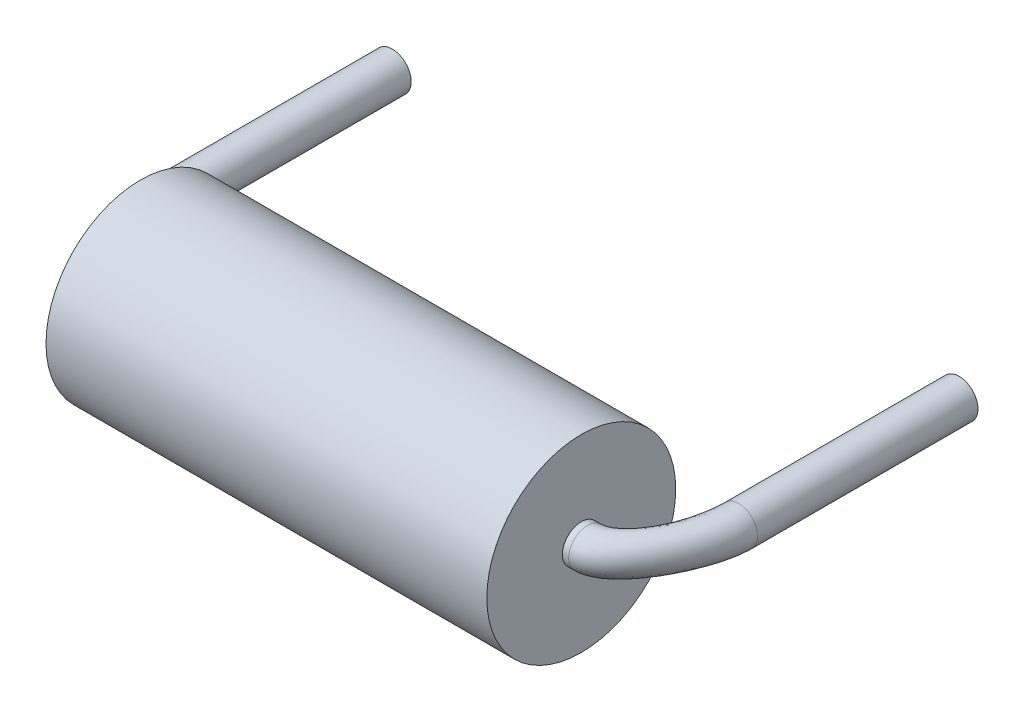
ISO-10303-21;
HEADER;
FILE_DESCRIPTION(('STEP AP214'),'2;1');
FILE_NAME('part.step','',(''),(''),'','','');
FILE_SCHEMA(('AUTOMOTIVE_DESIGN { 1 0 10303 214 1 1 1 1 }'));
ENDSEC;
DATA;
#1=APPLICATION_CONTEXT('core data for automotive mechanical design processes');
#2=APPLICATION_PROTOCOL_DEFINITION('international standard','automotive_design',2000,#1);
#3=PRODUCT_CONTEXT('',#1,'mechanical');
#4=PRODUCT('Part','Part','',(#3));
#5=PRODUCT_RELATED_PRODUCT_CATEGORY('part','',(#4));
#6=PRODUCT_DEFINITION_FORMATION('','',#4);
#7=PRODUCT_DEFINITION_CONTEXT('part definition',#1,'design');
#8=PRODUCT_DEFINITION('design','',#6,#7);
#9=PRODUCT_DEFINITION_SHAPE('','',#8);
#10=(LENGTH_UNIT() NAMED_UNIT(*) SI_UNIT(.MILLI.,.METRE.));
#11=(NAMED_UNIT(*) PLANE_ANGLE_UNIT() SI_UNIT($,.RADIAN.));
#12=(NAMED_UNIT(*) SI_UNIT($,.STERADIAN.) SOLID_ANGLE_UNIT());
#13=UNCERTAINTY_MEASURE_WITH_UNIT(LENGTH_MEASURE(1.E-05),#10,'distance_accuracy_value','');
#14=(GEOMETRIC_REPRESENTATION_CONTEXT(3) GLOBAL_UNCERTAINTY_ASSIGNED_CONTEXT((#13)) GLOBAL_UNIT_ASSIGNED_CONTEXT((#10,
#11,#12)) REPRESENTATION_CONTEXT('',''));
#15=CARTESIAN_POINT('',(0.,0.,0.));
#16=DIRECTION('',(0.,0.,1.));
#17=DIRECTION('',(1.,0.,0.));
#18=AXIS2_PLACEMENT_3D('',#15,#16,#17);
#19=CARTESIAN_POINT('',(4.5,0.,-3.));
#20=DIRECTION('',(0.,0.,1.));
#21=DIRECTION('',(1.,0.,0.));
#22=AXIS2_PLACEMENT_3D('',#19,#20,#21);
#23=CYLINDRICAL_SURFACE('',#22,0.3);
#24=CARTESIAN_POINT('',(4.5,0.,-3.));
#25=DIRECTION('',(0.,0.,1.));
#26=DIRECTION('',(1.,0.,0.));
#27=AXIS2_PLACEMENT_3D('',#24,#25,#26);
#28=CIRCLE('',#27,0.3);
#29=CARTESIAN_POINT('',(4.8,0.,-3.));
#30=VERTEX_POINT('',#29);
#31=EDGE_CURVE('E12',#30,#30,#28,.T.);
#32=ORIENTED_EDGE('',*,*,#31,.T.);
#33=EDGE_LOOP('',(#32));
#34=FACE_BOUND('',#33,.T.);
#35=CARTESIAN_POINT('',(4.44842126991618,-0.295532797846432,0.5));
#36=CARTESIAN_POINT('',(4.45657671926898,-0.296956151612734,0.5));
#37=CARTESIAN_POINT('',(4.47284975036704,-0.299113962988544,0.5));
#38=CARTESIAN_POINT('',(4.49705607303998,-0.300346978382131,0.5));
#39=CARTESIAN_POINT('',(4.52096955058723,-0.29963927890584,0.5));
#40=CARTESIAN_POINT('',(4.6621556182074,-0.284126713630345,0.5));
#41=CARTESIAN_POINT('',(4.7727591375856,-0.182065919728635,0.5));
#42=CARTESIAN_POINT('',(4.82399987317247,0.111530256972192,0.5));
#43=CARTESIAN_POINT('',(4.71468771713984,0.267065722520398,0.5));
#44=CARTESIAN_POINT('',(4.38846974302781,0.323999873172467,0.5));
#45=CARTESIAN_POINT('',(4.2329342774796,0.214687717139839,0.5));
#46=CARTESIAN_POINT('',(4.18169354189274,-0.0789084595609888,0.5));
#47=CARTESIAN_POINT('',(4.2511864051895,-0.212401103933292,0.5));
#48=CARTESIAN_POINT('',(4.3787709669585,-0.274821653191419,0.5));
#49=CARTESIAN_POINT('',(4.40103097345277,-0.283587915669048,0.5));
#50=CARTESIAN_POINT('',(4.42422390601289,-0.290627394596416,0.5));
#51=CARTESIAN_POINT('',(4.44026582056338,-0.294109444080131,0.5));
#52=CARTESIAN_POINT('',(4.44842126991618,-0.295532797846432,0.5));
#53=B_SPLINE_CURVE_WITH_KNOTS('',3,(#35,#36,#37,#38,#39,#40,#41,#42,#43,#44,#45,#46,#47,#48,#49,
#50,#51,#52),.UNSPECIFIED.,.T.,.F.,(4,1,1,1,1,2,2,2,1,1,1,1,4),(0.,0.0125,0.0249999999999999,
0.0375000000000001,0.05,0.25,0.5,0.75,0.95,0.9625,0.975,0.9875,1.),.UNSPECIFIED.);
#54=CARTESIAN_POINT('',(4.44842126991618,-0.295532797846432,0.5));
#55=VERTEX_POINT('',#54);
#56=EDGE_CURVE('E88',#55,#55,#53,.T.);
#57=ORIENTED_EDGE('',*,*,#56,.F.);
#58=EDGE_LOOP('',(#57));
#59=FACE_BOUND('',#58,.T.);
#60=ADVANCED_FACE('F79',(#34,#59),#23,.T.);
#61=CARTESIAN_POINT('',(4.5,0.,-3.));
#62=DIRECTION('',(0.,0.,1.));
#63=DIRECTION('',(1.,0.,0.));
#64=AXIS2_PLACEMENT_3D('',#61,#62,#63);
#65=PLANE('',#64);
#66=ORIENTED_EDGE('',*,*,#31,.F.);
#67=EDGE_LOOP('',(#66));
#68=FACE_BOUND('',#67,.T.);
#69=ADVANCED_FACE('F125',(#68),#65,.F.);
#70=CARTESIAN_POINT('',(4.44842126991618,-0.295532797846432,0.5));
#71=CARTESIAN_POINT('',(4.44842126991618,-0.295532797846432,1.05422112089113));
#72=CARTESIAN_POINT('',(4.06320447906993,-0.29838924359743,2.03104608357513));
#73=CARTESIAN_POINT('',(3.6,-0.29838924359743,2.03104608357513));
#74=CARTESIAN_POINT('',(4.45657671926898,-0.296956151612734,0.5));
#75=CARTESIAN_POINT('',(4.45657671926898,-0.296956151612734,1.05753129675138));
#76=CARTESIAN_POINT('',(4.06650420182207,-0.297532503621208,2.03928035869218));
#77=CARTESIAN_POINT('',(3.6,-0.297532503621208,2.03928035869218));
#78=CARTESIAN_POINT('',(4.47284975036704,-0.299113962988544,0.5));
#79=CARTESIAN_POINT('',(4.47284975036704,-0.299113962988544,1.06414658649145));
#80=CARTESIAN_POINT('',(4.07312329814521,-0.29516662253985,2.0555244437006));
#81=CARTESIAN_POINT('',(3.6,-0.29516662253985,2.0555244437006));
#82=CARTESIAN_POINT('',(4.49705607303998,-0.300346978382131,0.5));
#83=CARTESIAN_POINT('',(4.49705607303998,-0.300346978382131,1.0737852769768));
#84=CARTESIAN_POINT('',(4.08283956689731,-0.289745654842636,2.07914814987752));
#85=CARTESIAN_POINT('',(3.6,-0.289745654842636,2.07914814987752));
#86=CARTESIAN_POINT('',(4.52096955058723,-0.29963927890584,0.5));
#87=CARTESIAN_POINT('',(4.52096955058723,-0.29963927890584,1.08317537844411));
#88=CARTESIAN_POINT('',(4.09237699255412,-0.282537598381805,2.10196040906001));
#89=CARTESIAN_POINT('',(3.6,-0.282537598381805,2.10196040906001));
#90=CARTESIAN_POINT('',(4.6621556182074,-0.284126713630345,0.5));
#91=CARTESIAN_POINT('',(4.6621556182074,-0.284126713630345,1.13768051850633));
#92=CARTESIAN_POINT('',(4.14815025422444,-0.229077070904489,2.23355112823625));
#93=CARTESIAN_POINT('',(3.6,-0.229077070904489,2.23355112823625));
#94=CARTESIAN_POINT('',(4.7727591375856,-0.182065919728635,0.5));
#95=CARTESIAN_POINT('',(4.7727591375856,-0.182065919728635,1.17485618575627));
#96=CARTESIAN_POINT('',(4.19001767560452,-0.10070231829769,2.31209708321698));
#97=CARTESIAN_POINT('',(3.6,-0.10070231829769,2.31209708321698));
#98=CARTESIAN_POINT('',(4.82399987317247,0.111530256972192,0.5));
#99=CARTESIAN_POINT('',(4.82399987317247,0.111530256972192,1.1684390621478));
#100=CARTESIAN_POINT('',(4.1936302661122,0.195731585916149,2.28125444407299));
#101=CARTESIAN_POINT('',(3.6,0.195731585916149,2.28125444407299));
#102=CARTESIAN_POINT('',(4.71468771713984,0.267065722520398,0.5));
#103=CARTESIAN_POINT('',(4.71468771713984,0.267065722520398,1.10574755874025));
#104=CARTESIAN_POINT('',(4.13657626692314,0.315524043121869,2.13363941876589));
#105=CARTESIAN_POINT('',(3.6,0.315524043121869,2.13363941876589));
#106=CARTESIAN_POINT('',(4.38846974302781,0.323999873172467,0.5));
#107=CARTESIAN_POINT('',(4.38846974302781,0.323999873172467,0.986069004540985));
#108=CARTESIAN_POINT('',(4.01727358000048,0.28125444407299,1.80426841408385));
#109=CARTESIAN_POINT('',(3.6,0.28125444407299,1.80426841408385));
#110=CARTESIAN_POINT('',(4.2329342774796,0.214687717139839,0.5));
#111=CARTESIAN_POINT('',(4.2329342774796,0.214687717139839,0.929081953749269));
#112=CARTESIAN_POINT('',(3.95502489226688,0.133639418765895,1.68447595687813));
#113=CARTESIAN_POINT('',(3.6,0.133639418765895,1.68447595687813));
#114=CARTESIAN_POINT('',(4.18169354189274,-0.0789084595609888,0.5));
#115=CARTESIAN_POINT('',(4.18169354189274,-0.0789084595609888,0.930263711484875));
#116=CARTESIAN_POINT('',(3.94619490765103,-0.162794485447944,1.71531859602212));
#117=CARTESIAN_POINT('',(3.6,-0.162794485447944,1.71531859602212));
#118=CARTESIAN_POINT('',(4.2511864051895,-0.212401103933292,0.5));
#119=CARTESIAN_POINT('',(4.2511864051895,-0.212401103933292,0.970019400098507));
#120=CARTESIAN_POINT('',(3.98101852838641,-0.272249891745808,1.8186097291501));
#121=CARTESIAN_POINT('',(3.6,-0.272249891745808,1.8186097291501));
#122=CARTESIAN_POINT('',(4.3787709669585,-0.274821653191419,0.5));
#123=CARTESIAN_POINT('',(4.3787709669585,-0.274821653191419,1.0251367263365));
#124=CARTESIAN_POINT('',(4.03452160616302,-0.297475734330752,1.95838741777512));
#125=CARTESIAN_POINT('',(3.6,-0.297475734330752,1.95838741777512));
#126=CARTESIAN_POINT('',(4.40103097345277,-0.283587915669048,0.5));
#127=CARTESIAN_POINT('',(4.40103097345277,-0.283587915669048,1.03460207792587));
#128=CARTESIAN_POINT('',(4.04378010123321,-0.299833209553378,1.98219492830281));
#129=CARTESIAN_POINT('',(3.6,-0.299833209553378,1.98219492830281));
#130=CARTESIAN_POINT('',(4.42422390601289,-0.290627394596416,0.5));
#131=CARTESIAN_POINT('',(4.42422390601289,-0.290627394596416,1.04428553132996));
#132=CARTESIAN_POINT('',(4.05332496163237,-0.300274827242445,2.00642861060914));
#133=CARTESIAN_POINT('',(3.6,-0.300274827242445,2.00642861060914));
#134=CARTESIAN_POINT('',(4.44026582056338,-0.294109444080131,0.5));
#135=CARTESIAN_POINT('',(4.44026582056338,-0.294109444080131,1.05091094503088));
#136=CARTESIAN_POINT('',(4.05990475631779,-0.299245983573652,2.02281180845808));
#137=CARTESIAN_POINT('',(3.6,-0.299245983573652,2.02281180845808));
#138=CARTESIAN_POINT('',(4.44842126991618,-0.295532797846432,0.5));
#139=CARTESIAN_POINT('',(4.44842126991618,-0.295532797846432,1.05422112089113));
#140=CARTESIAN_POINT('',(4.06320447906993,-0.29838924359743,2.03104608357513));
#141=CARTESIAN_POINT('',(3.6,-0.29838924359743,2.03104608357513));
#142=B_SPLINE_SURFACE_WITH_KNOTS('',3,3,((#70,#71,#72,#73),(#74,#75,#76,#77),(#78,#79,#80,#81),
(#82,#83,#84,#85),(#86,#87,#88,#89),(#90,#91,#92,#93),(#94,#95,#96,#97),(#98,#99,#100,#101),
(#102,#103,#104,#105),(#106,#107,#108,#109),(#110,#111,#112,#113),(#114,#115,#116,#117),(#118,
#119,#120,#121),(#122,#123,#124,#125),(#126,#127,#128,#129),(#130,#131,#132,#133),(#134,#135,
#136,#137),(#138,#139,#140,#141)),.UNSPECIFIED.,.T.,.F.,.F.,(4,1,1,1,1,2,2,2,1,1,1,1,4),(4,4),
(0.,0.0125,0.0249999999999999,0.0375000000000001,0.05,0.25,0.5,0.75,0.95,0.9625,0.975,0.9875,
1.),(0.,1.),.UNSPECIFIED.);
#143=CARTESIAN_POINT('',(3.6,-0.29838924359743,2.03104608357513));
#144=CARTESIAN_POINT('',(3.6,-0.299245983573652,2.02281180845808));
#145=CARTESIAN_POINT('',(3.6,-0.300274827242445,2.00642861060914));
#146=CARTESIAN_POINT('',(3.6,-0.299833209553378,1.98219492830281));
#147=CARTESIAN_POINT('',(3.6,-0.297475734330752,1.95838741777512));
#148=CARTESIAN_POINT('',(3.6,-0.272249891745808,1.8186097291501));
#149=CARTESIAN_POINT('',(3.6,-0.162794485447944,1.71531859602212));
#150=CARTESIAN_POINT('',(3.6,0.133639418765895,1.68447595687813));
#151=CARTESIAN_POINT('',(3.6,0.28125444407299,1.80426841408385));
#152=CARTESIAN_POINT('',(3.6,0.315524043121869,2.13363941876589));
#153=CARTESIAN_POINT('',(3.6,0.195731585916149,2.28125444407299));
#154=CARTESIAN_POINT('',(3.6,-0.10070231829769,2.31209708321698));
#155=CARTESIAN_POINT('',(3.6,-0.229077070904489,2.23355112823625));
#156=CARTESIAN_POINT('',(3.6,-0.282537598381805,2.10196040906001));
#157=CARTESIAN_POINT('',(3.6,-0.289745654842636,2.07914814987752));
#158=CARTESIAN_POINT('',(3.6,-0.29516662253985,2.0555244437006));
#159=CARTESIAN_POINT('',(3.6,-0.297532503621208,2.03928035869218));
#160=CARTESIAN_POINT('',(3.6,-0.29838924359743,2.03104608357513));
#161=B_SPLINE_CURVE_WITH_KNOTS('',3,(#143,#144,#145,#146,#147,#148,#149,#150,#151,#152,#153,
#154,#155,#156,#157,#158,#159,#160),.UNSPECIFIED.,.T.,.F.,(4,1,1,1,1,2,2,2,1,1,1,1,4),(0.,
0.0125,0.025,0.0375,0.05,0.25,0.5,0.75,0.95,0.9625,0.975,0.9875,1.),.UNSPECIFIED.);
#162=CARTESIAN_POINT('',(3.6,-0.29838924359743,2.03104608357513));
#163=VERTEX_POINT('',#162);
#164=EDGE_CURVE('E289',#163,#163,#161,.T.);
#165=ORIENTED_EDGE('',*,*,#56,.T.);
#166=EDGE_LOOP('',(#165));
#167=FACE_BOUND('',#166,.T.);
#168=ORIENTED_EDGE('',*,*,#164,.T.);
#169=EDGE_LOOP('',(#168));
#170=FACE_BOUND('',#169,.T.);
#171=ADVANCED_FACE('F103',(#167,#170),#142,.T.);
#172=CARTESIAN_POINT('',(3.5,0.,2.));
#173=DIRECTION('',(-1.,0.,0.));
#174=DIRECTION('',(0.,0.,1.));
#175=AXIS2_PLACEMENT_3D('',#172,#173,#174);
#176=CYLINDRICAL_SURFACE('',#175,1.5);
#177=CARTESIAN_POINT('',(3.5,0.,2.));
#178=DIRECTION('',(1.,0.,0.));
#179=DIRECTION('',(0.,0.,-1.));
#180=AXIS2_PLACEMENT_3D('',#177,#178,#179);
#181=CIRCLE('',#180,1.5);
#182=CARTESIAN_POINT('',(3.5,0.,0.5));
#183=VERTEX_POINT('',#182);
#184=EDGE_CURVE('E304',#183,#183,#181,.T.);
#185=ORIENTED_EDGE('',*,*,#184,.F.);
#186=EDGE_LOOP('',(#185));
#187=FACE_BOUND('',#186,.T.);
#188=CARTESIAN_POINT('',(-3.5,0.,2.));
#189=DIRECTION('',(1.,0.,0.));
#190=DIRECTION('',(0.,0.,-1.));
#191=AXIS2_PLACEMENT_3D('',#188,#189,#190);
#192=CIRCLE('',#191,1.5);
#193=CARTESIAN_POINT('',(-3.5,0.,0.5));
#194=VERTEX_POINT('',#193);
#195=EDGE_CURVE('E314',#194,#194,#192,.T.);
#196=ORIENTED_EDGE('',*,*,#195,.T.);
#197=EDGE_LOOP('',(#196));
#198=FACE_BOUND('',#197,.T.);
#199=ADVANCED_FACE('F124',(#187,#198),#176,.T.);
#200=CARTESIAN_POINT('',(3.5,0.,2.));
#201=DIRECTION('',(1.,0.,0.));
#202=DIRECTION('',(0.,0.,-1.));
#203=AXIS2_PLACEMENT_3D('',#200,#201,#202);
#204=PLANE('',#203);
#205=CARTESIAN_POINT('',(3.5,0.,2.));
#206=DIRECTION('',(1.,0.,0.));
#207=DIRECTION('',(0.,0.,-1.));
#208=AXIS2_PLACEMENT_3D('',#205,#206,#207);
#209=CIRCLE('',#208,0.3);
#210=CARTESIAN_POINT('',(3.5,0.,1.7));
#211=VERTEX_POINT('',#210);
#212=EDGE_CURVE('E93',#211,#211,#209,.T.);
#213=ORIENTED_EDGE('',*,*,#212,.F.);
#214=EDGE_LOOP('',(#213));
#215=FACE_BOUND('',#214,.T.);
#216=ORIENTED_EDGE('',*,*,#184,.T.);
#217=EDGE_LOOP('',(#216));
#218=FACE_BOUND('',#217,.T.);
#219=ADVANCED_FACE('F155',(#215,#218),#204,.T.);
#220=CARTESIAN_POINT('',(3.6,0.,2.));
#221=DIRECTION('',(-1.,0.,0.));
#222=DIRECTION('',(0.,0.,1.));
#223=AXIS2_PLACEMENT_3D('',#220,#221,#222);
#224=CYLINDRICAL_SURFACE('',#223,0.3);
#225=ORIENTED_EDGE('',*,*,#164,.F.);
#226=EDGE_LOOP('',(#225));
#227=FACE_BOUND('',#226,.T.);
#228=ORIENTED_EDGE('',*,*,#212,.T.);
#229=EDGE_LOOP('',(#228));
#230=FACE_BOUND('',#229,.T.);
#231=ADVANCED_FACE('F165',(#227,#230),#224,.T.);
#232=CARTESIAN_POINT('',(-4.5,0.,-3.));
#233=DIRECTION('',(0.,0.,1.));
#234=DIRECTION('',(-1.,0.,0.));
#235=AXIS2_PLACEMENT_3D('',#232,#233,#234);
#236=CYLINDRICAL_SURFACE('',#235,0.3);
#237=CARTESIAN_POINT('',(-4.5,0.,-3.));
#238=DIRECTION('',(0.,0.,-1.));
#239=DIRECTION('',(-1.,0.,0.));
#240=AXIS2_PLACEMENT_3D('',#237,#238,#239);
#241=CIRCLE('',#240,0.3);
#242=CARTESIAN_POINT('',(-4.8,0.,-3.));
#243=VERTEX_POINT('',#242);
#244=EDGE_CURVE('E281',#243,#243,#241,.T.);
#245=ORIENTED_EDGE('',*,*,#244,.F.);
#246=EDGE_LOOP('',(#245));
#247=FACE_BOUND('',#246,.T.);
#248=CARTESIAN_POINT('',(-4.44842126991618,-0.295532797846432,0.5));
#249=CARTESIAN_POINT('',(-4.44026582056338,-0.294109444080131,0.5));
#250=CARTESIAN_POINT('',(-4.42422390601289,-0.290627394596416,0.5));
#251=CARTESIAN_POINT('',(-4.40103097345277,-0.283587915669048,0.5));
#252=CARTESIAN_POINT('',(-4.3787709669585,-0.274821653191419,0.5));
#253=CARTESIAN_POINT('',(-4.2511864051895,-0.212401103933292,0.5));
#254=CARTESIAN_POINT('',(-4.18169354189274,-0.0789084595609888,0.5));
#255=CARTESIAN_POINT('',(-4.2329342774796,0.214687717139839,0.5));
#256=CARTESIAN_POINT('',(-4.38846974302781,0.323999873172467,0.5));
#257=CARTESIAN_POINT('',(-4.71468771713984,0.267065722520398,0.5));
#258=CARTESIAN_POINT('',(-4.82399987317247,0.111530256972192,0.5));
#259=CARTESIAN_POINT('',(-4.7727591375856,-0.182065919728635,0.5));
#260=CARTESIAN_POINT('',(-4.6621556182074,-0.284126713630345,0.5));
#261=CARTESIAN_POINT('',(-4.52096955058723,-0.29963927890584,0.5));
#262=CARTESIAN_POINT('',(-4.49705607303998,-0.300346978382131,0.5));
#263=CARTESIAN_POINT('',(-4.47284975036704,-0.299113962988544,0.5));
#264=CARTESIAN_POINT('',(-4.45657671926898,-0.296956151612734,0.5));
#265=CARTESIAN_POINT('',(-4.44842126991618,-0.295532797846432,0.5));
#266=B_SPLINE_CURVE_WITH_KNOTS('',3,(#248,#249,#250,#251,#252,#253,#254,#255,#256,#257,#258,
#259,#260,#261,#262,#263,#264,#265),.UNSPECIFIED.,.T.,.F.,(4,1,1,1,1,2,2,2,1,1,1,1,4),(0.,
0.0125,0.025,0.0375,0.05,0.25,0.5,0.75,0.95,0.9625,0.975,0.9875,1.),.UNSPECIFIED.);
#267=CARTESIAN_POINT('',(-4.44842126991618,-0.295532797846432,0.5));
#268=VERTEX_POINT('',#267);
#269=EDGE_CURVE('E258',#268,#268,#266,.F.);
#270=ORIENTED_EDGE('',*,*,#269,.T.);
#271=EDGE_LOOP('',(#270));
#272=FACE_BOUND('',#271,.T.);
#273=ADVANCED_FACE('F173',(#247,#272),#236,.T.);
#274=CARTESIAN_POINT('',(-4.5,0.,-3.));
#275=DIRECTION('',(0.,0.,1.));
#276=DIRECTION('',(-1.,0.,0.));
#277=AXIS2_PLACEMENT_3D('',#274,#275,#276);
#278=PLANE('',#277);
#279=ORIENTED_EDGE('',*,*,#244,.T.);
#280=EDGE_LOOP('',(#279));
#281=FACE_BOUND('',#280,.T.);
#282=ADVANCED_FACE('F181',(#281),#278,.F.);
#283=CARTESIAN_POINT('',(-4.44842126991618,-0.295532797846432,0.5));
#284=CARTESIAN_POINT('',(-4.44842126991618,-0.295532797846432,1.05422112089113));
#285=CARTESIAN_POINT('',(-4.06320447906993,-0.29838924359743,2.03104608357513));
#286=CARTESIAN_POINT('',(-3.6,-0.29838924359743,2.03104608357513));
#287=CARTESIAN_POINT('',(-4.45657671926898,-0.296956151612734,0.5));
#288=CARTESIAN_POINT('',(-4.45657671926898,-0.296956151612734,1.05753129675138));
#289=CARTESIAN_POINT('',(-4.06650420182207,-0.297532503621208,2.03928035869218));
#290=CARTESIAN_POINT('',(-3.6,-0.297532503621208,2.03928035869218));
#291=CARTESIAN_POINT('',(-4.47284975036704,-0.299113962988544,0.5));
#292=CARTESIAN_POINT('',(-4.47284975036704,-0.299113962988544,1.06414658649145));
#293=CARTESIAN_POINT('',(-4.07312329814521,-0.29516662253985,2.0555244437006));
#294=CARTESIAN_POINT('',(-3.6,-0.29516662253985,2.0555244437006));
#295=CARTESIAN_POINT('',(-4.49705607303998,-0.300346978382131,0.5));
#296=CARTESIAN_POINT('',(-4.49705607303998,-0.300346978382131,1.0737852769768));
#297=CARTESIAN_POINT('',(-4.08283956689731,-0.289745654842636,2.07914814987752));
#298=CARTESIAN_POINT('',(-3.6,-0.289745654842636,2.07914814987752));
#299=CARTESIAN_POINT('',(-4.52096955058723,-0.29963927890584,0.5));
#300=CARTESIAN_POINT('',(-4.52096955058723,-0.29963927890584,1.08317537844411));
#301=CARTESIAN_POINT('',(-4.09237699255412,-0.282537598381805,2.10196040906001));
#302=CARTESIAN_POINT('',(-3.6,-0.282537598381805,2.10196040906001));
#303=CARTESIAN_POINT('',(-4.6621556182074,-0.284126713630345,0.5));
#304=CARTESIAN_POINT('',(-4.6621556182074,-0.284126713630345,1.13768051850633));
#305=CARTESIAN_POINT('',(-4.14815025422444,-0.229077070904489,2.23355112823625));
#306=CARTESIAN_POINT('',(-3.6,-0.229077070904489,2.23355112823625));
#307=CARTESIAN_POINT('',(-4.7727591375856,-0.182065919728635,0.5));
#308=CARTESIAN_POINT('',(-4.7727591375856,-0.182065919728635,1.17485618575627));
#309=CARTESIAN_POINT('',(-4.19001767560452,-0.10070231829769,2.31209708321698));
#310=CARTESIAN_POINT('',(-3.6,-0.10070231829769,2.31209708321698));
#311=CARTESIAN_POINT('',(-4.82399987317247,0.111530256972192,0.5));
#312=CARTESIAN_POINT('',(-4.82399987317247,0.111530256972192,1.1684390621478));
#313=CARTESIAN_POINT('',(-4.1936302661122,0.195731585916149,2.28125444407299));
#314=CARTESIAN_POINT('',(-3.6,0.195731585916149,2.28125444407299));
#315=CARTESIAN_POINT('',(-4.71468771713984,0.267065722520398,0.5));
#316=CARTESIAN_POINT('',(-4.71468771713984,0.267065722520398,1.10574755874025));
#317=CARTESIAN_POINT('',(-4.13657626692314,0.315524043121869,2.13363941876589));
#318=CARTESIAN_POINT('',(-3.6,0.315524043121869,2.13363941876589));
#319=CARTESIAN_POINT('',(-4.38846974302781,0.323999873172467,0.5));
#320=CARTESIAN_POINT('',(-4.38846974302781,0.323999873172467,0.986069004540985));
#321=CARTESIAN_POINT('',(-4.01727358000048,0.28125444407299,1.80426841408385));
#322=CARTESIAN_POINT('',(-3.6,0.28125444407299,1.80426841408385));
#323=CARTESIAN_POINT('',(-4.2329342774796,0.214687717139839,0.5));
#324=CARTESIAN_POINT('',(-4.2329342774796,0.214687717139839,0.929081953749269));
#325=CARTESIAN_POINT('',(-3.95502489226688,0.133639418765895,1.68447595687813));
#326=CARTESIAN_POINT('',(-3.6,0.133639418765895,1.68447595687813));
#327=CARTESIAN_POINT('',(-4.18169354189274,-0.0789084595609888,0.5));
#328=CARTESIAN_POINT('',(-4.18169354189274,-0.0789084595609888,0.930263711484875));
#329=CARTESIAN_POINT('',(-3.94619490765103,-0.162794485447944,1.71531859602212));
#330=CARTESIAN_POINT('',(-3.6,-0.162794485447944,1.71531859602212));
#331=CARTESIAN_POINT('',(-4.2511864051895,-0.212401103933292,0.5));
#332=CARTESIAN_POINT('',(-4.2511864051895,-0.212401103933292,0.970019400098507));
#333=CARTESIAN_POINT('',(-3.98101852838641,-0.272249891745808,1.8186097291501));
#334=CARTESIAN_POINT('',(-3.6,-0.272249891745808,1.8186097291501));
#335=CARTESIAN_POINT('',(-4.3787709669585,-0.274821653191419,0.5));
#336=CARTESIAN_POINT('',(-4.3787709669585,-0.274821653191419,1.0251367263365));
#337=CARTESIAN_POINT('',(-4.03452160616302,-0.297475734330752,1.95838741777512));
#338=CARTESIAN_POINT('',(-3.6,-0.297475734330752,1.95838741777512));
#339=CARTESIAN_POINT('',(-4.40103097345277,-0.283587915669048,0.5));
#340=CARTESIAN_POINT('',(-4.40103097345277,-0.283587915669048,1.03460207792587));
#341=CARTESIAN_POINT('',(-4.04378010123321,-0.299833209553378,1.98219492830281));
#342=CARTESIAN_POINT('',(-3.6,-0.299833209553378,1.98219492830281));
#343=CARTESIAN_POINT('',(-4.42422390601289,-0.290627394596416,0.5));
#344=CARTESIAN_POINT('',(-4.42422390601289,-0.290627394596416,1.04428553132996));
#345=CARTESIAN_POINT('',(-4.05332496163237,-0.300274827242445,2.00642861060914));
#346=CARTESIAN_POINT('',(-3.6,-0.300274827242445,2.00642861060914));
#347=CARTESIAN_POINT('',(-4.44026582056338,-0.294109444080131,0.5));
#348=CARTESIAN_POINT('',(-4.44026582056338,-0.294109444080131,1.05091094503088));
#349=CARTESIAN_POINT('',(-4.05990475631779,-0.299245983573652,2.02281180845808));
#350=CARTESIAN_POINT('',(-3.6,-0.299245983573652,2.02281180845808));
#351=CARTESIAN_POINT('',(-4.44842126991618,-0.295532797846432,0.5));
#352=CARTESIAN_POINT('',(-4.44842126991618,-0.295532797846432,1.05422112089113));
#353=CARTESIAN_POINT('',(-4.06320447906993,-0.29838924359743,2.03104608357513));
#354=CARTESIAN_POINT('',(-3.6,-0.29838924359743,2.03104608357513));
#355=B_SPLINE_SURFACE_WITH_KNOTS('',3,3,((#283,#284,#285,#286),(#287,#288,#289,#290),(#291,#292,
#293,#294),(#295,#296,#297,#298),(#299,#300,#301,#302),(#303,#304,#305,#306),(#307,#308,#309,
#310),(#311,#312,#313,#314),(#315,#316,#317,#318),(#319,#320,#321,#322),(#323,#324,#325,#326),
(#327,#328,#329,#330),(#331,#332,#333,#334),(#335,#336,#337,#338),(#339,#340,#341,#342),(#343,
#344,#345,#346),(#347,#348,#349,#350),(#351,#352,#353,#354)),.UNSPECIFIED.,.T.,.F.,.F.,(4,1,1,1,
1,2,2,2,1,1,1,1,4),(4,4),(0.,0.0125,0.0249999999999999,0.0375000000000001,0.05,0.25,0.5,0.75,
0.95,0.9625,0.975,0.9875,1.),(0.,1.),.UNSPECIFIED.);
#356=CARTESIAN_POINT('',(-3.6,-0.29838924359743,2.03104608357513));
#357=CARTESIAN_POINT('',(-3.6,-0.297532503621208,2.03928035869218));
#358=CARTESIAN_POINT('',(-3.6,-0.29516662253985,2.0555244437006));
#359=CARTESIAN_POINT('',(-3.6,-0.289745654842636,2.07914814987752));
#360=CARTESIAN_POINT('',(-3.6,-0.282537598381805,2.10196040906001));
#361=CARTESIAN_POINT('',(-3.6,-0.229077070904489,2.23355112823625));
#362=CARTESIAN_POINT('',(-3.6,-0.10070231829769,2.31209708321698));
#363=CARTESIAN_POINT('',(-3.6,0.195731585916149,2.28125444407299));
#364=CARTESIAN_POINT('',(-3.6,0.315524043121869,2.13363941876589));
#365=CARTESIAN_POINT('',(-3.6,0.28125444407299,1.80426841408385));
#366=CARTESIAN_POINT('',(-3.6,0.133639418765895,1.68447595687813));
#367=CARTESIAN_POINT('',(-3.6,-0.162794485447944,1.71531859602212));
#368=CARTESIAN_POINT('',(-3.6,-0.272249891745808,1.8186097291501));
#369=CARTESIAN_POINT('',(-3.6,-0.297475734330752,1.95838741777512));
#370=CARTESIAN_POINT('',(-3.6,-0.299833209553378,1.98219492830281));
#371=CARTESIAN_POINT('',(-3.6,-0.300274827242445,2.00642861060914));
#372=CARTESIAN_POINT('',(-3.6,-0.299245983573652,2.02281180845808));
#373=CARTESIAN_POINT('',(-3.6,-0.29838924359743,2.03104608357513));
#374=B_SPLINE_CURVE_WITH_KNOTS('',3,(#356,#357,#358,#359,#360,#361,#362,#363,#364,#365,#366,
#367,#368,#369,#370,#371,#372,#373),.UNSPECIFIED.,.T.,.F.,(4,1,1,1,1,2,2,2,1,1,1,1,4),(0.,
0.0125,0.0249999999999999,0.0375000000000001,0.05,0.25,0.5,0.75,0.95,0.9625,0.975,0.9875,1.),.UNSPECIFIED.);
#375=CARTESIAN_POINT('',(-3.6,-0.29838924359743,2.03104608357513));
#376=VERTEX_POINT('',#375);
#377=EDGE_CURVE('E317',#376,#376,#374,.F.);
#378=ORIENTED_EDGE('',*,*,#269,.F.);
#379=EDGE_LOOP('',(#378));
#380=FACE_BOUND('',#379,.T.);
#381=ORIENTED_EDGE('',*,*,#377,.F.);
#382=EDGE_LOOP('',(#381));
#383=FACE_BOUND('',#382,.T.);
#384=ADVANCED_FACE('F189',(#380,#383),#355,.F.);
#385=CARTESIAN_POINT('',(-3.5,0.,2.));
#386=DIRECTION('',(-1.,0.,0.));
#387=DIRECTION('',(0.,0.,-1.));
#388=AXIS2_PLACEMENT_3D('',#385,#386,#387);
#389=PLANE('',#388);
#390=CARTESIAN_POINT('',(-3.5,0.,2.));
#391=DIRECTION('',(1.,0.,0.));
#392=DIRECTION('',(0.,0.,-1.));
#393=AXIS2_PLACEMENT_3D('',#390,#391,#392);
#394=CIRCLE('',#393,0.3);
#395=CARTESIAN_POINT('',(-3.5,0.,1.7));
#396=VERTEX_POINT('',#395);
#397=EDGE_CURVE('E316',#396,#396,#394,.T.);
#398=ORIENTED_EDGE('',*,*,#397,.T.);
#399=EDGE_LOOP('',(#398));
#400=FACE_BOUND('',#399,.T.);
#401=ORIENTED_EDGE('',*,*,#195,.F.);
#402=EDGE_LOOP('',(#401));
#403=FACE_BOUND('',#402,.T.);
#404=ADVANCED_FACE('F197',(#400,#403),#389,.T.);
#405=CARTESIAN_POINT('',(-3.6,0.,2.));
#406=DIRECTION('',(1.,0.,0.));
#407=DIRECTION('',(0.,0.,1.));
#408=AXIS2_PLACEMENT_3D('',#405,#406,#407);
#409=CYLINDRICAL_SURFACE('',#408,0.3);
#410=ORIENTED_EDGE('',*,*,#377,.T.);
#411=EDGE_LOOP('',(#410));
#412=FACE_BOUND('',#411,.T.);
#413=ORIENTED_EDGE('',*,*,#397,.F.);
#414=EDGE_LOOP('',(#413));
#415=FACE_BOUND('',#414,.T.);
#416=ADVANCED_FACE('F206',(#412,#415),#409,.T.);
#417=CLOSED_SHELL('',(#60,#69,#171,#199,#219,#231,#273,#282,#384,#404,#416));
#418=MANIFOLD_SOLID_BREP('B2',#417);
#419=ADVANCED_BREP_SHAPE_REPRESENTATION('',(#18,#418),#14);
#420=SHAPE_DEFINITION_REPRESENTATION(#9,#419);
ENDSEC;
END-ISO-10303-21;
